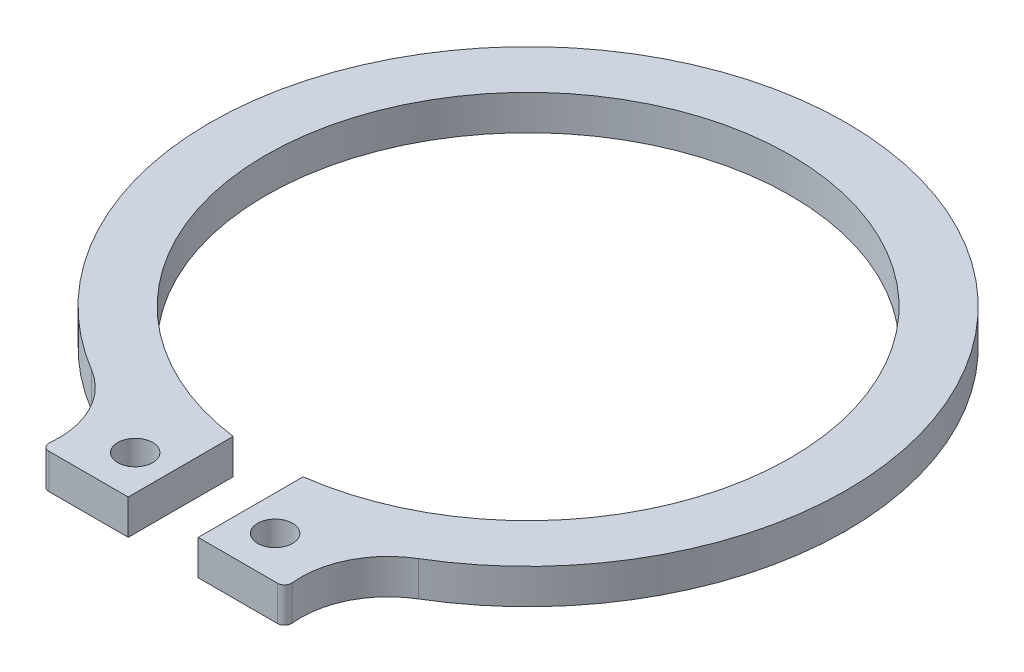
ISO-10303-21;
HEADER;
FILE_DESCRIPTION(('STEP AP214'),'2;1');
FILE_NAME('part.step','',(''),(''),'','','');
FILE_SCHEMA(('AUTOMOTIVE_DESIGN { 1 0 10303 214 1 1 1 1 }'));
ENDSEC;
DATA;
#1=APPLICATION_CONTEXT('core data for automotive mechanical design processes');
#2=APPLICATION_PROTOCOL_DEFINITION('international standard','automotive_design',2000,#1);
#3=PRODUCT_CONTEXT('',#1,'mechanical');
#4=PRODUCT('Part','Part','',(#3));
#5=PRODUCT_RELATED_PRODUCT_CATEGORY('part','',(#4));
#6=PRODUCT_DEFINITION_FORMATION('','',#4);
#7=PRODUCT_DEFINITION_CONTEXT('part definition',#1,'design');
#8=PRODUCT_DEFINITION('design','',#6,#7);
#9=PRODUCT_DEFINITION_SHAPE('','',#8);
#10=(LENGTH_UNIT() NAMED_UNIT(*) SI_UNIT(.MILLI.,.METRE.));
#11=(NAMED_UNIT(*) PLANE_ANGLE_UNIT() SI_UNIT($,.RADIAN.));
#12=(NAMED_UNIT(*) SI_UNIT($,.STERADIAN.) SOLID_ANGLE_UNIT());
#13=UNCERTAINTY_MEASURE_WITH_UNIT(LENGTH_MEASURE(1.E-05),#10,'distance_accuracy_value','');
#14=(GEOMETRIC_REPRESENTATION_CONTEXT(3) GLOBAL_UNCERTAINTY_ASSIGNED_CONTEXT((#13)) GLOBAL_UNIT_ASSIGNED_CONTEXT((#10,
#11,#12)) REPRESENTATION_CONTEXT('',''));
#15=CARTESIAN_POINT('',(0.,0.,0.));
#16=DIRECTION('',(0.,0.,1.));
#17=DIRECTION('',(1.,0.,0.));
#18=AXIS2_PLACEMENT_3D('',#15,#16,#17);
#19=CARTESIAN_POINT('',(-7.56152074685699,1.27,12.6433867296248));
#20=DIRECTION('',(0.,-1.,0.));
#21=DIRECTION('',(0.,0.,-1.));
#22=AXIS2_PLACEMENT_3D('',#19,#20,#21);
#23=CYLINDRICAL_SURFACE('',#22,3.175);
#24=CARTESIAN_POINT('',(-7.56152074685699,0.,12.6433867296248));
#25=DIRECTION('',(0.,1.,0.));
#26=DIRECTION('',(0.,0.,1.));
#27=AXIS2_PLACEMENT_3D('',#24,#25,#26);
#28=CIRCLE('',#27,3.175);
#29=CARTESIAN_POINT('',(-4.40334804126451,0.,12.9698375860345));
#30=VERTEX_POINT('',#29);
#31=CARTESIAN_POINT('',(-5.93188265486195,0.,9.91851889996425));
#32=VERTEX_POINT('',#31);
#33=EDGE_CURVE('E157',#30,#32,#28,.T.);
#34=ORIENTED_EDGE('',*,*,#33,.F.);
#35=DIRECTION('',(0.,-1.,0.));
#36=VECTOR('',#35,1.);
#37=CARTESIAN_POINT('',(-4.40334804126451,1.27,12.9698375860345));
#38=LINE('',#37,#36);
#39=CARTESIAN_POINT('',(-4.40334804126451,1.27,12.9698375860345));
#40=VERTEX_POINT('',#39);
#41=EDGE_CURVE('E11',#30,#40,#38,.F.);
#42=ORIENTED_EDGE('',*,*,#41,.T.);
#43=CARTESIAN_POINT('',(-7.56152074685699,1.27,12.6433867296248));
#44=DIRECTION('',(0.,1.,0.));
#45=DIRECTION('',(0.,0.,1.));
#46=AXIS2_PLACEMENT_3D('',#43,#44,#45);
#47=CIRCLE('',#46,3.175);
#48=CARTESIAN_POINT('',(-5.93188265486195,1.27,9.91851889996425));
#49=VERTEX_POINT('',#48);
#50=EDGE_CURVE('E132',#40,#49,#47,.T.);
#51=ORIENTED_EDGE('',*,*,#50,.T.);
#52=DIRECTION('',(0.,-1.,0.));
#53=VECTOR('',#52,1.);
#54=CARTESIAN_POINT('',(-5.93188265486195,1.27,9.91851889996425));
#55=LINE('',#54,#53);
#56=EDGE_CURVE('E150',#49,#32,#55,.T.);
#57=ORIENTED_EDGE('',*,*,#56,.T.);
#58=EDGE_LOOP('',(#34,#42,#51,#57));
#59=FACE_BOUND('',#58,.T.);
#60=ADVANCED_FACE('F36',(#59),#23,.F.);
#61=CARTESIAN_POINT('',(0.,1.27,13.2499536545473));
#62=DIRECTION('',(0.,0.,1.));
#63=DIRECTION('',(1.,0.,0.));
#64=AXIS2_PLACEMENT_3D('',#61,#62,#63);
#65=PLANE('',#64);
#66=DIRECTION('',(-1.,0.,0.));
#67=VECTOR('',#66,1.);
#68=CARTESIAN_POINT('',(0.,1.27,13.2499536545473));
#69=LINE('',#68,#67);
#70=CARTESIAN_POINT('',(-1.27,1.27,13.2499536545473));
#71=VERTEX_POINT('',#70);
#72=CARTESIAN_POINT('',(-4.15069422481711,1.27,13.2499536545473));
#73=VERTEX_POINT('',#72);
#74=EDGE_CURVE('E115',#71,#73,#69,.T.);
#75=ORIENTED_EDGE('',*,*,#74,.T.);
#76=DIRECTION('',(0.,-1.,0.));
#77=VECTOR('',#76,1.);
#78=CARTESIAN_POINT('',(-4.15069422481711,1.27,13.2499536545473));
#79=LINE('',#78,#77);
#80=CARTESIAN_POINT('',(-4.15069422481711,0.,13.2499536545473));
#81=VERTEX_POINT('',#80);
#82=EDGE_CURVE('E44',#73,#81,#79,.T.);
#83=ORIENTED_EDGE('',*,*,#82,.T.);
#84=DIRECTION('',(-1.,0.,0.));
#85=VECTOR('',#84,1.);
#86=CARTESIAN_POINT('',(0.,0.,13.2499536545473));
#87=LINE('',#86,#85);
#88=CARTESIAN_POINT('',(-1.27,0.,13.2499536545473));
#89=VERTEX_POINT('',#88);
#90=EDGE_CURVE('E118',#89,#81,#87,.T.);
#91=ORIENTED_EDGE('',*,*,#90,.F.);
#92=DIRECTION('',(0.,-1.,0.));
#93=VECTOR('',#92,1.);
#94=CARTESIAN_POINT('',(-1.27,1.27,13.2499536545473));
#95=LINE('',#94,#93);
#96=EDGE_CURVE('E112',#71,#89,#95,.T.);
#97=ORIENTED_EDGE('',*,*,#96,.F.);
#98=EDGE_LOOP('',(#75,#83,#91,#97));
#99=FACE_BOUND('',#98,.T.);
#100=ADVANCED_FACE('F113',(#99),#65,.T.);
#101=CARTESIAN_POINT('',(-1.27,1.27,0.));
#102=DIRECTION('',(1.,0.,0.));
#103=DIRECTION('',(0.,0.,-1.));
#104=AXIS2_PLACEMENT_3D('',#101,#102,#103);
#105=PLANE('',#104);
#106=DIRECTION('',(0.,0.,1.));
#107=VECTOR('',#106,1.);
#108=CARTESIAN_POINT('',(-1.27,0.,0.));
#109=LINE('',#108,#107);
#110=CARTESIAN_POINT('',(-1.27,0.,9.43995365454725));
#111=VERTEX_POINT('',#110);
#112=EDGE_CURVE('E160',#111,#89,#109,.T.);
#113=ORIENTED_EDGE('',*,*,#112,.F.);
#114=DIRECTION('',(0.,-1.,0.));
#115=VECTOR('',#114,1.);
#116=CARTESIAN_POINT('',(-1.27,1.27,9.43995365454725));
#117=LINE('',#116,#115);
#118=CARTESIAN_POINT('',(-1.27,1.27,9.43995365454725));
#119=VERTEX_POINT('',#118);
#120=EDGE_CURVE('E124',#119,#111,#117,.T.);
#121=ORIENTED_EDGE('',*,*,#120,.F.);
#122=DIRECTION('',(0.,0.,1.));
#123=VECTOR('',#122,1.);
#124=CARTESIAN_POINT('',(-1.27,1.27,0.));
#125=LINE('',#124,#123);
#126=EDGE_CURVE('E130',#119,#71,#125,.T.);
#127=ORIENTED_EDGE('',*,*,#126,.T.);
#128=ORIENTED_EDGE('',*,*,#96,.T.);
#129=EDGE_LOOP('',(#113,#121,#127,#128));
#130=FACE_BOUND('',#129,.T.);
#131=ADVANCED_FACE('F134',(#130),#105,.T.);
#132=CARTESIAN_POINT('',(0.,1.27,0.));
#133=DIRECTION('',(0.,-1.,0.));
#134=DIRECTION('',(0.,0.,-1.));
#135=AXIS2_PLACEMENT_3D('',#132,#133,#134);
#136=CYLINDRICAL_SURFACE('',#135,9.525);
#137=CARTESIAN_POINT('',(0.,0.,0.));
#138=DIRECTION('',(0.,1.,0.));
#139=DIRECTION('',(0.,0.,1.));
#140=AXIS2_PLACEMENT_3D('',#137,#138,#139);
#141=CIRCLE('',#140,9.525);
#142=CARTESIAN_POINT('',(1.27,0.,9.43995365454725));
#143=VERTEX_POINT('',#142);
#144=EDGE_CURVE('E162',#143,#111,#141,.T.);
#145=ORIENTED_EDGE('',*,*,#144,.F.);
#146=DIRECTION('',(0.,-1.,0.));
#147=VECTOR('',#146,1.);
#148=CARTESIAN_POINT('',(1.27,1.27,9.43995365454725));
#149=LINE('',#148,#147);
#150=CARTESIAN_POINT('',(1.27,1.27,9.43995365454725));
#151=VERTEX_POINT('',#150);
#152=EDGE_CURVE('E185',#151,#143,#149,.T.);
#153=ORIENTED_EDGE('',*,*,#152,.F.);
#154=CARTESIAN_POINT('',(0.,1.27,0.));
#155=DIRECTION('',(0.,1.,0.));
#156=DIRECTION('',(0.,0.,1.));
#157=AXIS2_PLACEMENT_3D('',#154,#155,#156);
#158=CIRCLE('',#157,9.525);
#159=EDGE_CURVE('E135',#151,#119,#158,.T.);
#160=ORIENTED_EDGE('',*,*,#159,.T.);
#161=ORIENTED_EDGE('',*,*,#120,.T.);
#162=EDGE_LOOP('',(#145,#153,#160,#161));
#163=FACE_BOUND('',#162,.T.);
#164=ADVANCED_FACE('F205',(#163),#136,.F.);
#165=CARTESIAN_POINT('',(1.27,1.27,0.));
#166=DIRECTION('',(1.,0.,0.));
#167=DIRECTION('',(0.,0.,-1.));
#168=AXIS2_PLACEMENT_3D('',#165,#166,#167);
#169=PLANE('',#168);
#170=DIRECTION('',(0.,0.,1.));
#171=VECTOR('',#170,1.);
#172=CARTESIAN_POINT('',(1.27,0.,0.));
#173=LINE('',#172,#171);
#174=CARTESIAN_POINT('',(1.27,0.,13.2499536545473));
#175=VERTEX_POINT('',#174);
#176=EDGE_CURVE('E165',#143,#175,#173,.T.);
#177=ORIENTED_EDGE('',*,*,#176,.T.);
#178=DIRECTION('',(0.,-1.,0.));
#179=VECTOR('',#178,1.);
#180=CARTESIAN_POINT('',(1.27,1.27,13.2499536545473));
#181=LINE('',#180,#179);
#182=CARTESIAN_POINT('',(1.27,1.27,13.2499536545473));
#183=VERTEX_POINT('',#182);
#184=EDGE_CURVE('E182',#183,#175,#181,.T.);
#185=ORIENTED_EDGE('',*,*,#184,.F.);
#186=DIRECTION('',(0.,0.,1.));
#187=VECTOR('',#186,1.);
#188=CARTESIAN_POINT('',(1.27,1.27,0.));
#189=LINE('',#188,#187);
#190=EDGE_CURVE('E137',#151,#183,#189,.T.);
#191=ORIENTED_EDGE('',*,*,#190,.F.);
#192=ORIENTED_EDGE('',*,*,#152,.T.);
#193=EDGE_LOOP('',(#177,#185,#191,#192));
#194=FACE_BOUND('',#193,.T.);
#195=ADVANCED_FACE('F210',(#194),#169,.F.);
#196=CARTESIAN_POINT('',(0.,1.27,13.2499536545473));
#197=DIRECTION('',(0.,0.,-1.));
#198=DIRECTION('',(-1.,0.,0.));
#199=AXIS2_PLACEMENT_3D('',#196,#197,#198);
#200=PLANE('',#199);
#201=DIRECTION('',(1.,0.,0.));
#202=VECTOR('',#201,1.);
#203=CARTESIAN_POINT('',(0.,0.,13.2499536545473));
#204=LINE('',#203,#202);
#205=CARTESIAN_POINT('',(4.15069422481711,0.,13.2499536545473));
#206=VERTEX_POINT('',#205);
#207=EDGE_CURVE('E168',#175,#206,#204,.T.);
#208=ORIENTED_EDGE('',*,*,#207,.T.);
#209=DIRECTION('',(0.,-1.,0.));
#210=VECTOR('',#209,1.);
#211=CARTESIAN_POINT('',(4.15069422481711,1.27,13.2499536545473));
#212=LINE('',#211,#210);
#213=CARTESIAN_POINT('',(4.15069422481711,1.27,13.2499536545473));
#214=VERTEX_POINT('',#213);
#215=EDGE_CURVE('E194',#206,#214,#212,.F.);
#216=ORIENTED_EDGE('',*,*,#215,.T.);
#217=DIRECTION('',(1.,0.,0.));
#218=VECTOR('',#217,1.);
#219=CARTESIAN_POINT('',(0.,1.27,13.2499536545473));
#220=LINE('',#219,#218);
#221=EDGE_CURVE('E143',#183,#214,#220,.T.);
#222=ORIENTED_EDGE('',*,*,#221,.F.);
#223=ORIENTED_EDGE('',*,*,#184,.T.);
#224=EDGE_LOOP('',(#208,#216,#222,#223));
#225=FACE_BOUND('',#224,.T.);
#226=ADVANCED_FACE('F212',(#225),#200,.F.);
#227=CARTESIAN_POINT('',(7.56152074685699,1.27,12.6433867296248));
#228=DIRECTION('',(0.,-1.,0.));
#229=DIRECTION('',(0.,0.,-1.));
#230=AXIS2_PLACEMENT_3D('',#227,#228,#229);
#231=CYLINDRICAL_SURFACE('',#230,3.175);
#232=CARTESIAN_POINT('',(7.56152074685699,1.27,12.6433867296248));
#233=DIRECTION('',(0.,1.,0.));
#234=DIRECTION('',(0.,0.,1.));
#235=AXIS2_PLACEMENT_3D('',#232,#233,#234);
#236=CIRCLE('',#235,3.175);
#237=CARTESIAN_POINT('',(4.40334804126451,1.27,12.9698375860345));
#238=VERTEX_POINT('',#237);
#239=CARTESIAN_POINT('',(5.93188265486195,1.27,9.91851889996425));
#240=VERTEX_POINT('',#239);
#241=EDGE_CURVE('E145',#238,#240,#236,.F.);
#242=ORIENTED_EDGE('',*,*,#241,.F.);
#243=DIRECTION('',(0.,-1.,0.));
#244=VECTOR('',#243,1.);
#245=CARTESIAN_POINT('',(4.40334804126451,1.27,12.9698375860345));
#246=LINE('',#245,#244);
#247=CARTESIAN_POINT('',(4.40334804126451,0.,12.9698375860345));
#248=VERTEX_POINT('',#247);
#249=EDGE_CURVE('E123',#238,#248,#246,.T.);
#250=ORIENTED_EDGE('',*,*,#249,.T.);
#251=CARTESIAN_POINT('',(7.56152074685699,0.,12.6433867296248));
#252=DIRECTION('',(0.,1.,0.));
#253=DIRECTION('',(0.,0.,1.));
#254=AXIS2_PLACEMENT_3D('',#251,#252,#253);
#255=CIRCLE('',#254,3.175);
#256=CARTESIAN_POINT('',(5.93188265486195,0.,9.91851889996425));
#257=VERTEX_POINT('',#256);
#258=EDGE_CURVE('E171',#248,#257,#255,.F.);
#259=ORIENTED_EDGE('',*,*,#258,.T.);
#260=DIRECTION('',(0.,-1.,0.));
#261=VECTOR('',#260,1.);
#262=CARTESIAN_POINT('',(5.93188265486195,1.27,9.91851889996425));
#263=LINE('',#262,#261);
#264=EDGE_CURVE('E179',#240,#257,#263,.T.);
#265=ORIENTED_EDGE('',*,*,#264,.F.);
#266=EDGE_LOOP('',(#242,#250,#259,#265));
#267=FACE_BOUND('',#266,.T.);
#268=ADVANCED_FACE('F221',(#267),#231,.F.);
#269=CARTESIAN_POINT('',(-2.54,1.27,11.7259536545473));
#270=DIRECTION('',(0.,-1.,0.));
#271=DIRECTION('',(0.,0.,-1.));
#272=AXIS2_PLACEMENT_3D('',#269,#270,#271);
#273=CYLINDRICAL_SURFACE('',#272,0.635);
#274=CARTESIAN_POINT('',(-2.54,1.27,11.7259536545473));
#275=DIRECTION('',(0.,1.,0.));
#276=DIRECTION('',(0.,0.,1.));
#277=AXIS2_PLACEMENT_3D('',#274,#275,#276);
#278=CIRCLE('',#277,0.635);
#279=CARTESIAN_POINT('',(-2.54,1.27,12.3609536545473));
#280=VERTEX_POINT('',#279);
#281=EDGE_CURVE('E226',#280,#280,#278,.T.);
#282=ORIENTED_EDGE('',*,*,#281,.T.);
#283=EDGE_LOOP('',(#282));
#284=FACE_BOUND('',#283,.T.);
#285=CARTESIAN_POINT('',(-2.54,0.,11.7259536545473));
#286=DIRECTION('',(0.,1.,0.));
#287=DIRECTION('',(0.,0.,1.));
#288=AXIS2_PLACEMENT_3D('',#285,#286,#287);
#289=CIRCLE('',#288,0.635);
#290=CARTESIAN_POINT('',(-2.54,0.,12.3609536545473));
#291=VERTEX_POINT('',#290);
#292=EDGE_CURVE('E154',#291,#291,#289,.T.);
#293=ORIENTED_EDGE('',*,*,#292,.F.);
#294=EDGE_LOOP('',(#293));
#295=FACE_BOUND('',#294,.T.);
#296=ADVANCED_FACE('F239',(#284,#295),#273,.F.);
#297=CARTESIAN_POINT('',(2.54,1.27,11.7259536545473));
#298=DIRECTION('',(0.,-1.,0.));
#299=DIRECTION('',(0.,0.,-1.));
#300=AXIS2_PLACEMENT_3D('',#297,#298,#299);
#301=CYLINDRICAL_SURFACE('',#300,0.635);
#302=CARTESIAN_POINT('',(2.54,1.27,11.7259536545473));
#303=DIRECTION('',(0.,1.,0.));
#304=DIRECTION('',(0.,0.,1.));
#305=AXIS2_PLACEMENT_3D('',#302,#303,#304);
#306=CIRCLE('',#305,0.635);
#307=CARTESIAN_POINT('',(2.54,1.27,12.3609536545473));
#308=VERTEX_POINT('',#307);
#309=EDGE_CURVE('E176',#308,#308,#306,.T.);
#310=ORIENTED_EDGE('',*,*,#309,.T.);
#311=EDGE_LOOP('',(#310));
#312=FACE_BOUND('',#311,.T.);
#313=CARTESIAN_POINT('',(2.54,0.,11.7259536545473));
#314=DIRECTION('',(0.,1.,0.));
#315=DIRECTION('',(0.,0.,1.));
#316=AXIS2_PLACEMENT_3D('',#313,#314,#315);
#317=CIRCLE('',#316,0.635);
#318=CARTESIAN_POINT('',(2.54,0.,12.3609536545473));
#319=VERTEX_POINT('',#318);
#320=EDGE_CURVE('E151',#319,#319,#317,.T.);
#321=ORIENTED_EDGE('',*,*,#320,.F.);
#322=EDGE_LOOP('',(#321));
#323=FACE_BOUND('',#322,.T.);
#324=ADVANCED_FACE('F242',(#312,#323),#301,.F.);
#325=CARTESIAN_POINT('',(0.,1.27,0.));
#326=DIRECTION('',(0.,-1.,0.));
#327=DIRECTION('',(0.,0.,-1.));
#328=AXIS2_PLACEMENT_3D('',#325,#326,#327);
#329=CYLINDRICAL_SURFACE('',#328,11.557);
#330=CARTESIAN_POINT('',(0.,0.,0.));
#331=DIRECTION('',(0.,1.,0.));
#332=DIRECTION('',(0.,0.,1.));
#333=AXIS2_PLACEMENT_3D('',#330,#331,#332);
#334=CIRCLE('',#333,11.557);
#335=EDGE_CURVE('E173',#257,#32,#334,.T.);
#336=ORIENTED_EDGE('',*,*,#335,.T.);
#337=ORIENTED_EDGE('',*,*,#56,.F.);
#338=CARTESIAN_POINT('',(0.,1.27,0.));
#339=DIRECTION('',(0.,1.,0.));
#340=DIRECTION('',(0.,0.,1.));
#341=AXIS2_PLACEMENT_3D('',#338,#339,#340);
#342=CIRCLE('',#341,11.557);
#343=EDGE_CURVE('E147',#240,#49,#342,.T.);
#344=ORIENTED_EDGE('',*,*,#343,.F.);
#345=ORIENTED_EDGE('',*,*,#264,.T.);
#346=EDGE_LOOP('',(#336,#337,#344,#345));
#347=FACE_BOUND('',#346,.T.);
#348=ADVANCED_FACE('F224',(#347),#329,.T.);
#349=CARTESIAN_POINT('',(0.,1.27,0.));
#350=DIRECTION('',(0.,1.,0.));
#351=DIRECTION('',(0.,0.,1.));
#352=AXIS2_PLACEMENT_3D('',#349,#350,#351);
#353=PLANE('',#352);
#354=ORIENTED_EDGE('',*,*,#309,.F.);
#355=EDGE_LOOP('',(#354));
#356=FACE_BOUND('',#355,.T.);
#357=ORIENTED_EDGE('',*,*,#281,.F.);
#358=EDGE_LOOP('',(#357));
#359=FACE_BOUND('',#358,.T.);
#360=ORIENTED_EDGE('',*,*,#221,.T.);
#361=CARTESIAN_POINT('',(4.15069422481711,1.27,12.9959536545473));
#362=DIRECTION('',(0.,1.,0.));
#363=DIRECTION('',(0.,0.,1.));
#364=AXIS2_PLACEMENT_3D('',#361,#362,#363);
#365=CIRCLE('',#364,0.254);
#366=EDGE_CURVE('E197',#214,#238,#365,.T.);
#367=ORIENTED_EDGE('',*,*,#366,.T.);
#368=ORIENTED_EDGE('',*,*,#241,.T.);
#369=ORIENTED_EDGE('',*,*,#343,.T.);
#370=ORIENTED_EDGE('',*,*,#50,.F.);
#371=CARTESIAN_POINT('',(-4.15069422481711,1.27,12.9959536545473));
#372=DIRECTION('',(0.,1.,0.));
#373=DIRECTION('',(0.,0.,1.));
#374=AXIS2_PLACEMENT_3D('',#371,#372,#373);
#375=CIRCLE('',#374,0.254);
#376=EDGE_CURVE('E51',#40,#73,#375,.T.);
#377=ORIENTED_EDGE('',*,*,#376,.T.);
#378=ORIENTED_EDGE('',*,*,#74,.F.);
#379=ORIENTED_EDGE('',*,*,#126,.F.);
#380=ORIENTED_EDGE('',*,*,#159,.F.);
#381=ORIENTED_EDGE('',*,*,#190,.T.);
#382=EDGE_LOOP('',(#360,#367,#368,#369,#370,#377,#378,#379,#380,#381));
#383=FACE_BOUND('',#382,.T.);
#384=ADVANCED_FACE('F128',(#356,#359,#383),#353,.T.);
#385=CARTESIAN_POINT('',(0.,0.,0.));
#386=DIRECTION('',(0.,1.,0.));
#387=DIRECTION('',(0.,0.,1.));
#388=AXIS2_PLACEMENT_3D('',#385,#386,#387);
#389=PLANE('',#388);
#390=ORIENTED_EDGE('',*,*,#320,.T.);
#391=EDGE_LOOP('',(#390));
#392=FACE_BOUND('',#391,.T.);
#393=ORIENTED_EDGE('',*,*,#292,.T.);
#394=EDGE_LOOP('',(#393));
#395=FACE_BOUND('',#394,.T.);
#396=ORIENTED_EDGE('',*,*,#258,.F.);
#397=CARTESIAN_POINT('',(4.15069422481711,0.,12.9959536545473));
#398=DIRECTION('',(0.,1.,0.));
#399=DIRECTION('',(0.,0.,1.));
#400=AXIS2_PLACEMENT_3D('',#397,#398,#399);
#401=CIRCLE('',#400,0.254);
#402=EDGE_CURVE('E192',#248,#206,#401,.F.);
#403=ORIENTED_EDGE('',*,*,#402,.T.);
#404=ORIENTED_EDGE('',*,*,#207,.F.);
#405=ORIENTED_EDGE('',*,*,#176,.F.);
#406=ORIENTED_EDGE('',*,*,#144,.T.);
#407=ORIENTED_EDGE('',*,*,#112,.T.);
#408=ORIENTED_EDGE('',*,*,#90,.T.);
#409=CARTESIAN_POINT('',(-4.15069422481711,0.,12.9959536545473));
#410=DIRECTION('',(0.,1.,0.));
#411=DIRECTION('',(0.,0.,1.));
#412=AXIS2_PLACEMENT_3D('',#409,#410,#411);
#413=CIRCLE('',#412,0.254);
#414=EDGE_CURVE('E190',#81,#30,#413,.F.);
#415=ORIENTED_EDGE('',*,*,#414,.T.);
#416=ORIENTED_EDGE('',*,*,#33,.T.);
#417=ORIENTED_EDGE('',*,*,#335,.F.);
#418=EDGE_LOOP('',(#396,#403,#404,#405,#406,#407,#408,#415,#416,#417));
#419=FACE_BOUND('',#418,.T.);
#420=ADVANCED_FACE('F201',(#392,#395,#419),#389,.F.);
#421=CARTESIAN_POINT('',(4.15069422481711,1.27,12.9959536545473));
#422=DIRECTION('',(0.,-1.,0.));
#423=DIRECTION('',(0.,0.,-1.));
#424=AXIS2_PLACEMENT_3D('',#421,#422,#423);
#425=CYLINDRICAL_SURFACE('',#424,0.254);
#426=ORIENTED_EDGE('',*,*,#366,.F.);
#427=ORIENTED_EDGE('',*,*,#215,.F.);
#428=ORIENTED_EDGE('',*,*,#402,.F.);
#429=ORIENTED_EDGE('',*,*,#249,.F.);
#430=EDGE_LOOP('',(#426,#427,#428,#429));
#431=FACE_BOUND('',#430,.T.);
#432=ADVANCED_FACE('F215',(#431),#425,.T.);
#433=CARTESIAN_POINT('',(-4.15069422481711,1.27,12.9959536545473));
#434=DIRECTION('',(0.,-1.,0.));
#435=DIRECTION('',(0.,0.,-1.));
#436=AXIS2_PLACEMENT_3D('',#433,#434,#435);
#437=CYLINDRICAL_SURFACE('',#436,0.254);
#438=ORIENTED_EDGE('',*,*,#376,.F.);
#439=ORIENTED_EDGE('',*,*,#41,.F.);
#440=ORIENTED_EDGE('',*,*,#414,.F.);
#441=ORIENTED_EDGE('',*,*,#82,.F.);
#442=EDGE_LOOP('',(#438,#439,#440,#441));
#443=FACE_BOUND('',#442,.T.);
#444=ADVANCED_FACE('F38',(#443),#437,.T.);
#445=CLOSED_SHELL('',(#60,#100,#131,#164,#195,#226,#268,#296,#324,#348,#384,#420,#432,#444));
#446=MANIFOLD_SOLID_BREP('B2',#445);
#447=ADVANCED_BREP_SHAPE_REPRESENTATION('',(#18,#446),#14);
#448=SHAPE_DEFINITION_REPRESENTATION(#9,#447);
ENDSEC;
END-ISO-10303-21;
